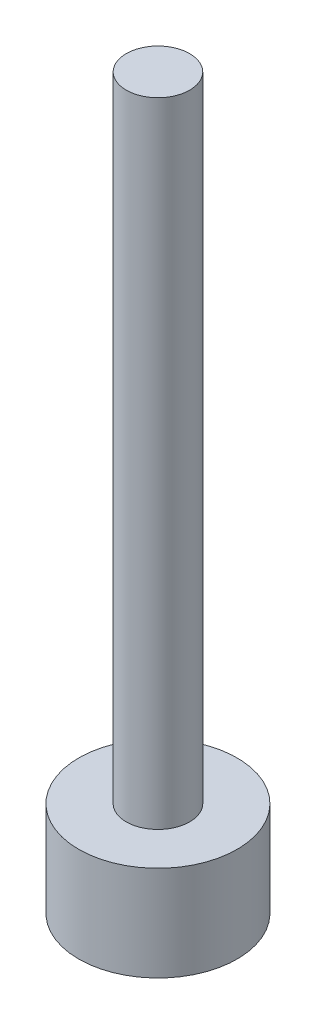
ISO-10303-21;
HEADER;
FILE_DESCRIPTION(('STEP AP214'),'2;1');
FILE_NAME('part.step','',(''),(''),'','','');
FILE_SCHEMA(('AUTOMOTIVE_DESIGN { 1 0 10303 214 1 1 1 1 }'));
ENDSEC;
DATA;
#1=APPLICATION_CONTEXT('core data for automotive mechanical design processes');
#2=APPLICATION_PROTOCOL_DEFINITION('international standard','automotive_design',2000,#1);
#3=PRODUCT_CONTEXT('',#1,'mechanical');
#4=PRODUCT('Part','Part','',(#3));
#5=PRODUCT_RELATED_PRODUCT_CATEGORY('part','',(#4));
#6=PRODUCT_DEFINITION_FORMATION('','',#4);
#7=PRODUCT_DEFINITION_CONTEXT('part definition',#1,'design');
#8=PRODUCT_DEFINITION('design','',#6,#7);
#9=PRODUCT_DEFINITION_SHAPE('','',#8);
#10=(LENGTH_UNIT() NAMED_UNIT(*) SI_UNIT(.MILLI.,.METRE.));
#11=(NAMED_UNIT(*) PLANE_ANGLE_UNIT() SI_UNIT($,.RADIAN.));
#12=(NAMED_UNIT(*) SI_UNIT($,.STERADIAN.) SOLID_ANGLE_UNIT());
#13=UNCERTAINTY_MEASURE_WITH_UNIT(LENGTH_MEASURE(1.E-05),#10,'distance_accuracy_value','');
#14=(GEOMETRIC_REPRESENTATION_CONTEXT(3) GLOBAL_UNCERTAINTY_ASSIGNED_CONTEXT((#13)) GLOBAL_UNIT_ASSIGNED_CONTEXT((#10,
#11,#12)) REPRESENTATION_CONTEXT('',''));
#15=CARTESIAN_POINT('',(0.,0.,0.));
#16=DIRECTION('',(0.,0.,1.));
#17=DIRECTION('',(1.,0.,0.));
#18=AXIS2_PLACEMENT_3D('',#15,#16,#17);
#19=CARTESIAN_POINT('',(0.,3.,0.));
#20=DIRECTION('',(0.,-1.,0.));
#21=DIRECTION('',(0.,0.,-1.));
#22=AXIS2_PLACEMENT_3D('',#19,#20,#21);
#23=CYLINDRICAL_SURFACE('',#22,2.5);
#24=CARTESIAN_POINT('',(0.,3.,0.));
#25=DIRECTION('',(0.,1.,0.));
#26=DIRECTION('',(0.,0.,1.));
#27=AXIS2_PLACEMENT_3D('',#24,#25,#26);
#28=CIRCLE('',#27,2.5);
#29=CARTESIAN_POINT('',(0.,3.,2.5));
#30=VERTEX_POINT('',#29);
#31=EDGE_CURVE('E38',#30,#30,#28,.T.);
#32=ORIENTED_EDGE('',*,*,#31,.F.);
#33=EDGE_LOOP('',(#32));
#34=FACE_BOUND('',#33,.T.);
#35=CARTESIAN_POINT('',(0.,0.,0.));
#36=DIRECTION('',(0.,1.,0.));
#37=DIRECTION('',(0.,0.,1.));
#38=AXIS2_PLACEMENT_3D('',#35,#36,#37);
#39=CIRCLE('',#38,2.5);
#40=CARTESIAN_POINT('',(0.,0.,2.5));
#41=VERTEX_POINT('',#40);
#42=EDGE_CURVE('E34',#41,#41,#39,.T.);
#43=ORIENTED_EDGE('',*,*,#42,.T.);
#44=EDGE_LOOP('',(#43));
#45=FACE_BOUND('',#44,.T.);
#46=ADVANCED_FACE('F31',(#34,#45),#23,.T.);
#47=CARTESIAN_POINT('',(0.,3.,0.));
#48=DIRECTION('',(0.,1.,0.));
#49=DIRECTION('',(0.,0.,1.));
#50=AXIS2_PLACEMENT_3D('',#47,#48,#49);
#51=PLANE('',#50);
#52=CARTESIAN_POINT('',(0.,3.,0.));
#53=DIRECTION('',(0.,1.,0.));
#54=DIRECTION('',(0.,0.,1.));
#55=AXIS2_PLACEMENT_3D('',#52,#53,#54);
#56=CIRCLE('',#55,1.);
#57=CARTESIAN_POINT('',(0.,3.,1.));
#58=VERTEX_POINT('',#57);
#59=EDGE_CURVE('E10',#58,#58,#56,.T.);
#60=ORIENTED_EDGE('',*,*,#59,.F.);
#61=EDGE_LOOP('',(#60));
#62=FACE_BOUND('',#61,.T.);
#63=ORIENTED_EDGE('',*,*,#31,.T.);
#64=EDGE_LOOP('',(#63));
#65=FACE_BOUND('',#64,.T.);
#66=ADVANCED_FACE('F55',(#62,#65),#51,.T.);
#67=CARTESIAN_POINT('',(0.,0.,0.));
#68=DIRECTION('',(0.,1.,0.));
#69=DIRECTION('',(0.,0.,1.));
#70=AXIS2_PLACEMENT_3D('',#67,#68,#69);
#71=PLANE('',#70);
#72=ORIENTED_EDGE('',*,*,#42,.F.);
#73=EDGE_LOOP('',(#72));
#74=FACE_BOUND('',#73,.T.);
#75=ADVANCED_FACE('F52',(#74),#71,.F.);
#76=CARTESIAN_POINT('',(0.,23.,0.));
#77=DIRECTION('',(0.,-1.,0.));
#78=DIRECTION('',(0.,0.,-1.));
#79=AXIS2_PLACEMENT_3D('',#76,#77,#78);
#80=CYLINDRICAL_SURFACE('',#79,1.);
#81=CARTESIAN_POINT('',(0.,23.,0.));
#82=DIRECTION('',(0.,1.,0.));
#83=DIRECTION('',(0.,0.,1.));
#84=AXIS2_PLACEMENT_3D('',#81,#82,#83);
#85=CIRCLE('',#84,1.);
#86=CARTESIAN_POINT('',(0.,23.,1.));
#87=VERTEX_POINT('',#86);
#88=EDGE_CURVE('E44',#87,#87,#85,.T.);
#89=ORIENTED_EDGE('',*,*,#88,.F.);
#90=EDGE_LOOP('',(#89));
#91=FACE_BOUND('',#90,.T.);
#92=ORIENTED_EDGE('',*,*,#59,.T.);
#93=EDGE_LOOP('',(#92));
#94=FACE_BOUND('',#93,.T.);
#95=ADVANCED_FACE('F54',(#91,#94),#80,.T.);
#96=CARTESIAN_POINT('',(0.,23.,0.));
#97=DIRECTION('',(0.,1.,0.));
#98=DIRECTION('',(0.,0.,1.));
#99=AXIS2_PLACEMENT_3D('',#96,#97,#98);
#100=PLANE('',#99);
#101=ORIENTED_EDGE('',*,*,#88,.T.);
#102=EDGE_LOOP('',(#101));
#103=FACE_BOUND('',#102,.T.);
#104=ADVANCED_FACE('F60',(#103),#100,.T.);
#105=CLOSED_SHELL('',(#46,#66,#75,#95,#104));
#106=MANIFOLD_SOLID_BREP('B2',#105);
#107=ADVANCED_BREP_SHAPE_REPRESENTATION('',(#18,#106),#14);
#108=SHAPE_DEFINITION_REPRESENTATION(#9,#107);
ENDSEC;
END-ISO-10303-21;
